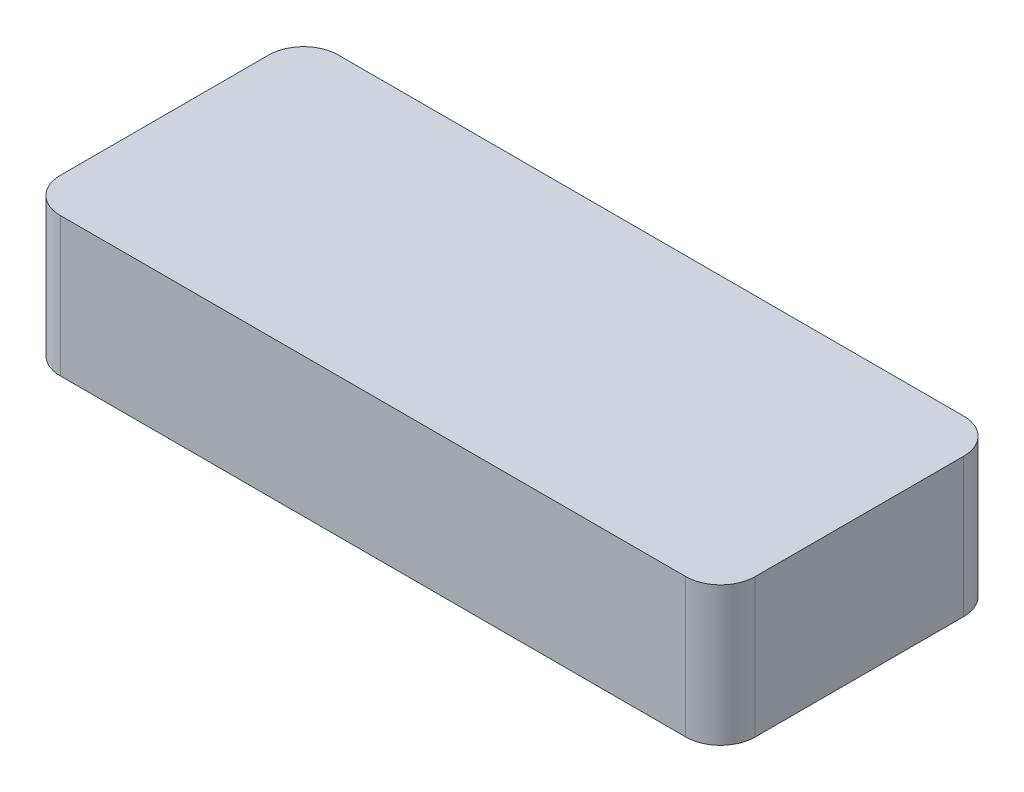
ISO-10303-21;
HEADER;
FILE_DESCRIPTION(('STEP AP214'),'2;1');
FILE_NAME('part.step','',(''),(''),'','','');
FILE_SCHEMA(('AUTOMOTIVE_DESIGN { 1 0 10303 214 1 1 1 1 }'));
ENDSEC;
DATA;
#1=APPLICATION_CONTEXT('core data for automotive mechanical design processes');
#2=APPLICATION_PROTOCOL_DEFINITION('international standard','automotive_design',2000,#1);
#3=PRODUCT_CONTEXT('',#1,'mechanical');
#4=PRODUCT('Part','Part','',(#3));
#5=PRODUCT_RELATED_PRODUCT_CATEGORY('part','',(#4));
#6=PRODUCT_DEFINITION_FORMATION('','',#4);
#7=PRODUCT_DEFINITION_CONTEXT('part definition',#1,'design');
#8=PRODUCT_DEFINITION('design','',#6,#7);
#9=PRODUCT_DEFINITION_SHAPE('','',#8);
#10=(LENGTH_UNIT() NAMED_UNIT(*) SI_UNIT(.MILLI.,.METRE.));
#11=(NAMED_UNIT(*) PLANE_ANGLE_UNIT() SI_UNIT($,.RADIAN.));
#12=(NAMED_UNIT(*) SI_UNIT($,.STERADIAN.) SOLID_ANGLE_UNIT());
#13=UNCERTAINTY_MEASURE_WITH_UNIT(LENGTH_MEASURE(1.E-05),#10,'distance_accuracy_value','');
#14=(GEOMETRIC_REPRESENTATION_CONTEXT(3) GLOBAL_UNCERTAINTY_ASSIGNED_CONTEXT((#13)) GLOBAL_UNIT_ASSIGNED_CONTEXT((#10,
#11,#12)) REPRESENTATION_CONTEXT('',''));
#15=CARTESIAN_POINT('',(0.,0.,0.));
#16=DIRECTION('',(0.,0.,1.));
#17=DIRECTION('',(1.,0.,0.));
#18=AXIS2_PLACEMENT_3D('',#15,#16,#17);
#19=CARTESIAN_POINT('',(15.875,6.35,-6.35));
#20=DIRECTION('',(-1.,0.,0.));
#21=DIRECTION('',(0.,0.,1.));
#22=AXIS2_PLACEMENT_3D('',#19,#20,#21);
#23=PLANE('',#22);
#24=DIRECTION('',(0.,0.,-1.));
#25=VECTOR('',#24,1.);
#26=CARTESIAN_POINT('',(15.875,0.,-6.35));
#27=LINE('',#26,#25);
#28=CARTESIAN_POINT('',(15.875,0.,4.7625));
#29=VERTEX_POINT('',#28);
#30=CARTESIAN_POINT('',(15.875,0.,-4.7625));
#31=VERTEX_POINT('',#30);
#32=EDGE_CURVE('E129',#29,#31,#27,.T.);
#33=ORIENTED_EDGE('',*,*,#32,.T.);
#34=DIRECTION('',(0.,-1.,0.));
#35=VECTOR('',#34,1.);
#36=CARTESIAN_POINT('',(15.875,6.35,-4.7625));
#37=LINE('',#36,#35);
#38=CARTESIAN_POINT('',(15.875,6.35,-4.7625));
#39=VERTEX_POINT('',#38);
#40=EDGE_CURVE('E11',#31,#39,#37,.F.);
#41=ORIENTED_EDGE('',*,*,#40,.T.);
#42=DIRECTION('',(0.,0.,-1.));
#43=VECTOR('',#42,1.);
#44=CARTESIAN_POINT('',(15.875,6.35,-6.35));
#45=LINE('',#44,#43);
#46=CARTESIAN_POINT('',(15.875,6.35,4.7625));
#47=VERTEX_POINT('',#46);
#48=EDGE_CURVE('E127',#47,#39,#45,.T.);
#49=ORIENTED_EDGE('',*,*,#48,.F.);
#50=DIRECTION('',(0.,-1.,0.));
#51=VECTOR('',#50,1.);
#52=CARTESIAN_POINT('',(15.875,6.35,4.7625));
#53=LINE('',#52,#51);
#54=EDGE_CURVE('E41',#47,#29,#53,.T.);
#55=ORIENTED_EDGE('',*,*,#54,.T.);
#56=EDGE_LOOP('',(#33,#41,#49,#55));
#57=FACE_BOUND('',#56,.T.);
#58=ADVANCED_FACE('F33',(#57),#23,.F.);
#59=CARTESIAN_POINT('',(-15.875,6.35,-6.35));
#60=DIRECTION('',(0.,0.,1.));
#61=DIRECTION('',(1.,0.,0.));
#62=AXIS2_PLACEMENT_3D('',#59,#60,#61);
#63=PLANE('',#62);
#64=DIRECTION('',(-1.,0.,0.));
#65=VECTOR('',#64,1.);
#66=CARTESIAN_POINT('',(-15.875,0.,-6.35));
#67=LINE('',#66,#65);
#68=CARTESIAN_POINT('',(14.2875,0.,-6.35));
#69=VERTEX_POINT('',#68);
#70=CARTESIAN_POINT('',(-14.2875,0.,-6.35));
#71=VERTEX_POINT('',#70);
#72=EDGE_CURVE('E125',#69,#71,#67,.T.);
#73=ORIENTED_EDGE('',*,*,#72,.T.);
#74=DIRECTION('',(0.,-1.,0.));
#75=VECTOR('',#74,1.);
#76=CARTESIAN_POINT('',(-14.2875,6.35,-6.35));
#77=LINE('',#76,#75);
#78=CARTESIAN_POINT('',(-14.2875,6.35,-6.35));
#79=VERTEX_POINT('',#78);
#80=EDGE_CURVE('E104',#71,#79,#77,.F.);
#81=ORIENTED_EDGE('',*,*,#80,.T.);
#82=DIRECTION('',(-1.,0.,0.));
#83=VECTOR('',#82,1.);
#84=CARTESIAN_POINT('',(-15.875,6.35,-6.35));
#85=LINE('',#84,#83);
#86=CARTESIAN_POINT('',(14.2875,6.35,-6.35));
#87=VERTEX_POINT('',#86);
#88=EDGE_CURVE('E165',#87,#79,#85,.T.);
#89=ORIENTED_EDGE('',*,*,#88,.F.);
#90=DIRECTION('',(0.,-1.,0.));
#91=VECTOR('',#90,1.);
#92=CARTESIAN_POINT('',(14.2875,6.35,-6.35));
#93=LINE('',#92,#91);
#94=EDGE_CURVE('E109',#87,#69,#93,.T.);
#95=ORIENTED_EDGE('',*,*,#94,.T.);
#96=EDGE_LOOP('',(#73,#81,#89,#95));
#97=FACE_BOUND('',#96,.T.);
#98=ADVANCED_FACE('F175',(#97),#63,.F.);
#99=CARTESIAN_POINT('',(-15.875,6.35,-6.35));
#100=DIRECTION('',(1.,0.,0.));
#101=DIRECTION('',(0.,0.,-1.));
#102=AXIS2_PLACEMENT_3D('',#99,#100,#101);
#103=PLANE('',#102);
#104=DIRECTION('',(0.,0.,1.));
#105=VECTOR('',#104,1.);
#106=CARTESIAN_POINT('',(-15.875,6.35,-6.35));
#107=LINE('',#106,#105);
#108=CARTESIAN_POINT('',(-15.875,6.35,-4.7625));
#109=VERTEX_POINT('',#108);
#110=CARTESIAN_POINT('',(-15.875,6.35,4.7625));
#111=VERTEX_POINT('',#110);
#112=EDGE_CURVE('E118',#109,#111,#107,.T.);
#113=ORIENTED_EDGE('',*,*,#112,.F.);
#114=DIRECTION('',(0.,-1.,0.));
#115=VECTOR('',#114,1.);
#116=CARTESIAN_POINT('',(-15.875,6.35,-4.7625));
#117=LINE('',#116,#115);
#118=CARTESIAN_POINT('',(-15.875,0.,-4.7625));
#119=VERTEX_POINT('',#118);
#120=EDGE_CURVE('E103',#109,#119,#117,.T.);
#121=ORIENTED_EDGE('',*,*,#120,.T.);
#122=DIRECTION('',(0.,0.,1.));
#123=VECTOR('',#122,1.);
#124=CARTESIAN_POINT('',(-15.875,0.,-6.35));
#125=LINE('',#124,#123);
#126=CARTESIAN_POINT('',(-15.875,0.,4.7625));
#127=VERTEX_POINT('',#126);
#128=EDGE_CURVE('E116',#119,#127,#125,.T.);
#129=ORIENTED_EDGE('',*,*,#128,.T.);
#130=DIRECTION('',(0.,-1.,0.));
#131=VECTOR('',#130,1.);
#132=CARTESIAN_POINT('',(-15.875,6.35,4.7625));
#133=LINE('',#132,#131);
#134=EDGE_CURVE('E120',#127,#111,#133,.F.);
#135=ORIENTED_EDGE('',*,*,#134,.T.);
#136=EDGE_LOOP('',(#113,#121,#129,#135));
#137=FACE_BOUND('',#136,.T.);
#138=ADVANCED_FACE('F115',(#137),#103,.F.);
#139=CARTESIAN_POINT('',(-15.875,6.35,6.35));
#140=DIRECTION('',(0.,0.,-1.));
#141=DIRECTION('',(-1.,0.,0.));
#142=AXIS2_PLACEMENT_3D('',#139,#140,#141);
#143=PLANE('',#142);
#144=DIRECTION('',(1.,0.,0.));
#145=VECTOR('',#144,1.);
#146=CARTESIAN_POINT('',(-15.875,6.35,6.35));
#147=LINE('',#146,#145);
#148=CARTESIAN_POINT('',(-14.2875,6.35,6.35));
#149=VERTEX_POINT('',#148);
#150=CARTESIAN_POINT('',(14.2875,6.35,6.35));
#151=VERTEX_POINT('',#150);
#152=EDGE_CURVE('E133',#149,#151,#147,.T.);
#153=ORIENTED_EDGE('',*,*,#152,.F.);
#154=DIRECTION('',(0.,-1.,0.));
#155=VECTOR('',#154,1.);
#156=CARTESIAN_POINT('',(-14.2875,6.35,6.35));
#157=LINE('',#156,#155);
#158=CARTESIAN_POINT('',(-14.2875,0.,6.35));
#159=VERTEX_POINT('',#158);
#160=EDGE_CURVE('E150',#149,#159,#157,.T.);
#161=ORIENTED_EDGE('',*,*,#160,.T.);
#162=DIRECTION('',(1.,0.,0.));
#163=VECTOR('',#162,1.);
#164=CARTESIAN_POINT('',(-15.875,0.,6.35));
#165=LINE('',#164,#163);
#166=CARTESIAN_POINT('',(14.2875,0.,6.35));
#167=VERTEX_POINT('',#166);
#168=EDGE_CURVE('E124',#159,#167,#165,.T.);
#169=ORIENTED_EDGE('',*,*,#168,.T.);
#170=DIRECTION('',(0.,-1.,0.));
#171=VECTOR('',#170,1.);
#172=CARTESIAN_POINT('',(14.2875,6.35,6.35));
#173=LINE('',#172,#171);
#174=EDGE_CURVE('E48',#167,#151,#173,.F.);
#175=ORIENTED_EDGE('',*,*,#174,.T.);
#176=EDGE_LOOP('',(#153,#161,#169,#175));
#177=FACE_BOUND('',#176,.T.);
#178=ADVANCED_FACE('F179',(#177),#143,.F.);
#179=CARTESIAN_POINT('',(0.,6.35,0.));
#180=DIRECTION('',(0.,1.,0.));
#181=DIRECTION('',(0.,0.,1.));
#182=AXIS2_PLACEMENT_3D('',#179,#180,#181);
#183=PLANE('',#182);
#184=ORIENTED_EDGE('',*,*,#88,.T.);
#185=CARTESIAN_POINT('',(-14.2875,6.35,-4.7625));
#186=DIRECTION('',(0.,1.,0.));
#187=DIRECTION('',(0.,0.,1.));
#188=AXIS2_PLACEMENT_3D('',#185,#186,#187);
#189=CIRCLE('',#188,1.5875);
#190=EDGE_CURVE('E147',#79,#109,#189,.T.);
#191=ORIENTED_EDGE('',*,*,#190,.T.);
#192=ORIENTED_EDGE('',*,*,#112,.T.);
#193=CARTESIAN_POINT('',(-14.2875,6.35,4.7625));
#194=DIRECTION('',(0.,1.,0.));
#195=DIRECTION('',(0.,0.,1.));
#196=AXIS2_PLACEMENT_3D('',#193,#194,#195);
#197=CIRCLE('',#196,1.5875);
#198=EDGE_CURVE('E55',#111,#149,#197,.T.);
#199=ORIENTED_EDGE('',*,*,#198,.T.);
#200=ORIENTED_EDGE('',*,*,#152,.T.);
#201=CARTESIAN_POINT('',(14.2875,6.35,4.7625));
#202=DIRECTION('',(0.,1.,0.));
#203=DIRECTION('',(0.,0.,1.));
#204=AXIS2_PLACEMENT_3D('',#201,#202,#203);
#205=CIRCLE('',#204,1.5875);
#206=EDGE_CURVE('E142',#151,#47,#205,.T.);
#207=ORIENTED_EDGE('',*,*,#206,.T.);
#208=ORIENTED_EDGE('',*,*,#48,.T.);
#209=CARTESIAN_POINT('',(14.2875,6.35,-4.7625));
#210=DIRECTION('',(0.,1.,0.));
#211=DIRECTION('',(0.,0.,1.));
#212=AXIS2_PLACEMENT_3D('',#209,#210,#211);
#213=CIRCLE('',#212,1.5875);
#214=EDGE_CURVE('E144',#39,#87,#213,.T.);
#215=ORIENTED_EDGE('',*,*,#214,.T.);
#216=EDGE_LOOP('',(#184,#191,#192,#199,#200,#207,#208,#215));
#217=FACE_BOUND('',#216,.T.);
#218=ADVANCED_FACE('F169',(#217),#183,.T.);
#219=CARTESIAN_POINT('',(0.,0.,0.));
#220=DIRECTION('',(0.,1.,0.));
#221=DIRECTION('',(0.,0.,1.));
#222=AXIS2_PLACEMENT_3D('',#219,#220,#221);
#223=PLANE('',#222);
#224=ORIENTED_EDGE('',*,*,#128,.F.);
#225=CARTESIAN_POINT('',(-14.2875,0.,-4.7625));
#226=DIRECTION('',(0.,1.,0.));
#227=DIRECTION('',(0.,0.,1.));
#228=AXIS2_PLACEMENT_3D('',#225,#226,#227);
#229=CIRCLE('',#228,1.5875);
#230=EDGE_CURVE('E99',#119,#71,#229,.F.);
#231=ORIENTED_EDGE('',*,*,#230,.T.);
#232=ORIENTED_EDGE('',*,*,#72,.F.);
#233=CARTESIAN_POINT('',(14.2875,0.,-4.7625));
#234=DIRECTION('',(0.,1.,0.));
#235=DIRECTION('',(0.,0.,1.));
#236=AXIS2_PLACEMENT_3D('',#233,#234,#235);
#237=CIRCLE('',#236,1.5875);
#238=EDGE_CURVE('E136',#69,#31,#237,.F.);
#239=ORIENTED_EDGE('',*,*,#238,.T.);
#240=ORIENTED_EDGE('',*,*,#32,.F.);
#241=CARTESIAN_POINT('',(14.2875,0.,4.7625));
#242=DIRECTION('',(0.,1.,0.));
#243=DIRECTION('',(0.,0.,1.));
#244=AXIS2_PLACEMENT_3D('',#241,#242,#243);
#245=CIRCLE('',#244,1.5875);
#246=EDGE_CURVE('E119',#29,#167,#245,.F.);
#247=ORIENTED_EDGE('',*,*,#246,.T.);
#248=ORIENTED_EDGE('',*,*,#168,.F.);
#249=CARTESIAN_POINT('',(-14.2875,0.,4.7625));
#250=DIRECTION('',(0.,1.,0.));
#251=DIRECTION('',(0.,0.,1.));
#252=AXIS2_PLACEMENT_3D('',#249,#250,#251);
#253=CIRCLE('',#252,1.5875);
#254=EDGE_CURVE('E110',#159,#127,#253,.F.);
#255=ORIENTED_EDGE('',*,*,#254,.T.);
#256=EDGE_LOOP('',(#224,#231,#232,#239,#240,#247,#248,#255));
#257=FACE_BOUND('',#256,.T.);
#258=ADVANCED_FACE('F122',(#257),#223,.F.);
#259=CARTESIAN_POINT('',(-14.2875,6.35,-4.7625));
#260=DIRECTION('',(0.,-1.,0.));
#261=DIRECTION('',(0.,0.,-1.));
#262=AXIS2_PLACEMENT_3D('',#259,#260,#261);
#263=CYLINDRICAL_SURFACE('',#262,1.5875);
#264=ORIENTED_EDGE('',*,*,#190,.F.);
#265=ORIENTED_EDGE('',*,*,#80,.F.);
#266=ORIENTED_EDGE('',*,*,#230,.F.);
#267=ORIENTED_EDGE('',*,*,#120,.F.);
#268=EDGE_LOOP('',(#264,#265,#266,#267));
#269=FACE_BOUND('',#268,.T.);
#270=ADVANCED_FACE('F102',(#269),#263,.T.);
#271=CARTESIAN_POINT('',(-14.2875,6.35,4.7625));
#272=DIRECTION('',(0.,-1.,0.));
#273=DIRECTION('',(0.,0.,-1.));
#274=AXIS2_PLACEMENT_3D('',#271,#272,#273);
#275=CYLINDRICAL_SURFACE('',#274,1.5875);
#276=ORIENTED_EDGE('',*,*,#198,.F.);
#277=ORIENTED_EDGE('',*,*,#134,.F.);
#278=ORIENTED_EDGE('',*,*,#254,.F.);
#279=ORIENTED_EDGE('',*,*,#160,.F.);
#280=EDGE_LOOP('',(#276,#277,#278,#279));
#281=FACE_BOUND('',#280,.T.);
#282=ADVANCED_FACE('F178',(#281),#275,.T.);
#283=CARTESIAN_POINT('',(14.2875,6.35,-4.7625));
#284=DIRECTION('',(0.,-1.,0.));
#285=DIRECTION('',(0.,0.,-1.));
#286=AXIS2_PLACEMENT_3D('',#283,#284,#285);
#287=CYLINDRICAL_SURFACE('',#286,1.5875);
#288=ORIENTED_EDGE('',*,*,#214,.F.);
#289=ORIENTED_EDGE('',*,*,#40,.F.);
#290=ORIENTED_EDGE('',*,*,#238,.F.);
#291=ORIENTED_EDGE('',*,*,#94,.F.);
#292=EDGE_LOOP('',(#288,#289,#290,#291));
#293=FACE_BOUND('',#292,.T.);
#294=ADVANCED_FACE('F173',(#293),#287,.T.);
#295=CARTESIAN_POINT('',(14.2875,6.35,4.7625));
#296=DIRECTION('',(0.,-1.,0.));
#297=DIRECTION('',(0.,0.,-1.));
#298=AXIS2_PLACEMENT_3D('',#295,#296,#297);
#299=CYLINDRICAL_SURFACE('',#298,1.5875);
#300=ORIENTED_EDGE('',*,*,#206,.F.);
#301=ORIENTED_EDGE('',*,*,#174,.F.);
#302=ORIENTED_EDGE('',*,*,#246,.F.);
#303=ORIENTED_EDGE('',*,*,#54,.F.);
#304=EDGE_LOOP('',(#300,#301,#302,#303));
#305=FACE_BOUND('',#304,.T.);
#306=ADVANCED_FACE('F35',(#305),#299,.T.);
#307=CLOSED_SHELL('',(#58,#98,#138,#178,#218,#258,#270,#282,#294,#306));
#308=MANIFOLD_SOLID_BREP('B2',#307);
#309=ADVANCED_BREP_SHAPE_REPRESENTATION('',(#18,#308),#14);
#310=SHAPE_DEFINITION_REPRESENTATION(#9,#309);
ENDSEC;
END-ISO-10303-21;
